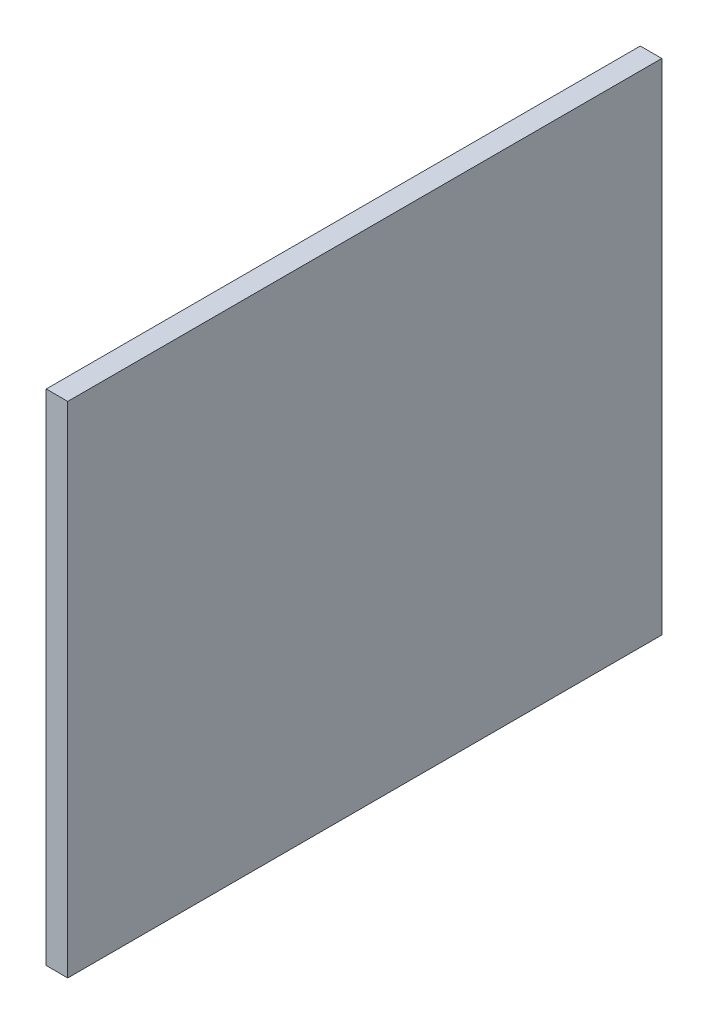
ISO-10303-21;
HEADER;
FILE_DESCRIPTION(('STEP AP214'),'2;1');
FILE_NAME('part.step','',(''),(''),'','','');
FILE_SCHEMA(('AUTOMOTIVE_DESIGN { 1 0 10303 214 1 1 1 1 }'));
ENDSEC;
DATA;
#1=APPLICATION_CONTEXT('core data for automotive mechanical design processes');
#2=APPLICATION_PROTOCOL_DEFINITION('international standard','automotive_design',2000,#1);
#3=PRODUCT_CONTEXT('',#1,'mechanical');
#4=PRODUCT('Part','Part','',(#3));
#5=PRODUCT_RELATED_PRODUCT_CATEGORY('part','',(#4));
#6=PRODUCT_DEFINITION_FORMATION('','',#4);
#7=PRODUCT_DEFINITION_CONTEXT('part definition',#1,'design');
#8=PRODUCT_DEFINITION('design','',#6,#7);
#9=PRODUCT_DEFINITION_SHAPE('','',#8);
#10=(LENGTH_UNIT() NAMED_UNIT(*) SI_UNIT(.MILLI.,.METRE.));
#11=(NAMED_UNIT(*) PLANE_ANGLE_UNIT() SI_UNIT($,.RADIAN.));
#12=(NAMED_UNIT(*) SI_UNIT($,.STERADIAN.) SOLID_ANGLE_UNIT());
#13=UNCERTAINTY_MEASURE_WITH_UNIT(LENGTH_MEASURE(1.E-05),#10,'distance_accuracy_value','');
#14=(GEOMETRIC_REPRESENTATION_CONTEXT(3) GLOBAL_UNCERTAINTY_ASSIGNED_CONTEXT((#13)) GLOBAL_UNIT_ASSIGNED_CONTEXT((#10,
#11,#12)) REPRESENTATION_CONTEXT('',''));
#15=CARTESIAN_POINT('',(0.,0.,0.));
#16=DIRECTION('',(0.,0.,1.));
#17=DIRECTION('',(1.,0.,0.));
#18=AXIS2_PLACEMENT_3D('',#15,#16,#17);
#19=CARTESIAN_POINT('',(0.5,-4.91094890510949,-6.43357664233577));
#20=DIRECTION('',(0.,0.,1.));
#21=DIRECTION('',(1.,0.,0.));
#22=AXIS2_PLACEMENT_3D('',#19,#20,#21);
#23=PLANE('',#22);
#24=DIRECTION('',(0.,1.,0.));
#25=VECTOR('',#24,1.);
#26=CARTESIAN_POINT('',(0.,-4.91094890510949,-6.43357664233577));
#27=LINE('',#26,#25);
#28=CARTESIAN_POINT('',(0.,-4.91094890510949,-6.43357664233577));
#29=VERTEX_POINT('',#28);
#30=CARTESIAN_POINT('',(0.,6.68905109489051,-6.43357664233577));
#31=VERTEX_POINT('',#30);
#32=EDGE_CURVE('E96',#29,#31,#27,.T.);
#33=ORIENTED_EDGE('',*,*,#32,.T.);
#34=DIRECTION('',(-1.,0.,0.));
#35=VECTOR('',#34,1.);
#36=CARTESIAN_POINT('',(0.5,6.68905109489051,-6.43357664233577));
#37=LINE('',#36,#35);
#38=CARTESIAN_POINT('',(0.5,6.68905109489051,-6.43357664233577));
#39=VERTEX_POINT('',#38);
#40=EDGE_CURVE('E11',#39,#31,#37,.T.);
#41=ORIENTED_EDGE('',*,*,#40,.F.);
#42=DIRECTION('',(0.,1.,0.));
#43=VECTOR('',#42,1.);
#44=CARTESIAN_POINT('',(0.5,-4.91094890510949,-6.43357664233577));
#45=LINE('',#44,#43);
#46=CARTESIAN_POINT('',(0.5,-4.91094890510949,-6.43357664233577));
#47=VERTEX_POINT('',#46);
#48=EDGE_CURVE('E84',#47,#39,#45,.T.);
#49=ORIENTED_EDGE('',*,*,#48,.F.);
#50=DIRECTION('',(-1.,0.,0.));
#51=VECTOR('',#50,1.);
#52=CARTESIAN_POINT('',(0.5,-4.91094890510949,-6.43357664233577));
#53=LINE('',#52,#51);
#54=EDGE_CURVE('E92',#47,#29,#53,.T.);
#55=ORIENTED_EDGE('',*,*,#54,.T.);
#56=EDGE_LOOP('',(#33,#41,#49,#55));
#57=FACE_BOUND('',#56,.T.);
#58=ADVANCED_FACE('F33',(#57),#23,.F.);
#59=CARTESIAN_POINT('',(0.5,6.68905109489051,-6.43357664233577));
#60=DIRECTION('',(0.,-1.,0.));
#61=DIRECTION('',(0.,0.,-1.));
#62=AXIS2_PLACEMENT_3D('',#59,#60,#61);
#63=PLANE('',#62);
#64=DIRECTION('',(0.,0.,1.));
#65=VECTOR('',#64,1.);
#66=CARTESIAN_POINT('',(0.,6.68905109489051,-6.43357664233577));
#67=LINE('',#66,#65);
#68=CARTESIAN_POINT('',(0.,6.68905109489051,7.36642335766423));
#69=VERTEX_POINT('',#68);
#70=EDGE_CURVE('E88',#31,#69,#67,.T.);
#71=ORIENTED_EDGE('',*,*,#70,.T.);
#72=DIRECTION('',(-1.,0.,0.));
#73=VECTOR('',#72,1.);
#74=CARTESIAN_POINT('',(0.5,6.68905109489051,7.36642335766423));
#75=LINE('',#74,#73);
#76=CARTESIAN_POINT('',(0.5,6.68905109489051,7.36642335766423));
#77=VERTEX_POINT('',#76);
#78=EDGE_CURVE('E41',#77,#69,#75,.T.);
#79=ORIENTED_EDGE('',*,*,#78,.F.);
#80=DIRECTION('',(0.,0.,1.));
#81=VECTOR('',#80,1.);
#82=CARTESIAN_POINT('',(0.5,6.68905109489051,-6.43357664233577));
#83=LINE('',#82,#81);
#84=EDGE_CURVE('E79',#39,#77,#83,.T.);
#85=ORIENTED_EDGE('',*,*,#84,.F.);
#86=ORIENTED_EDGE('',*,*,#40,.T.);
#87=EDGE_LOOP('',(#71,#79,#85,#86));
#88=FACE_BOUND('',#87,.T.);
#89=ADVANCED_FACE('F87',(#88),#63,.F.);
#90=CARTESIAN_POINT('',(0.5,-4.91094890510949,7.36642335766423));
#91=DIRECTION('',(0.,0.,-1.));
#92=DIRECTION('',(-1.,0.,0.));
#93=AXIS2_PLACEMENT_3D('',#90,#91,#92);
#94=PLANE('',#93);
#95=DIRECTION('',(0.,-1.,0.));
#96=VECTOR('',#95,1.);
#97=CARTESIAN_POINT('',(0.,-4.91094890510949,7.36642335766423));
#98=LINE('',#97,#96);
#99=CARTESIAN_POINT('',(0.,-4.91094890510949,7.36642335766423));
#100=VERTEX_POINT('',#99);
#101=EDGE_CURVE('E66',#69,#100,#98,.T.);
#102=ORIENTED_EDGE('',*,*,#101,.T.);
#103=DIRECTION('',(-1.,0.,0.));
#104=VECTOR('',#103,1.);
#105=CARTESIAN_POINT('',(0.5,-4.91094890510949,7.36642335766423));
#106=LINE('',#105,#104);
#107=CARTESIAN_POINT('',(0.5,-4.91094890510949,7.36642335766423));
#108=VERTEX_POINT('',#107);
#109=EDGE_CURVE('E89',#108,#100,#106,.T.);
#110=ORIENTED_EDGE('',*,*,#109,.F.);
#111=DIRECTION('',(0.,-1.,0.));
#112=VECTOR('',#111,1.);
#113=CARTESIAN_POINT('',(0.5,-4.91094890510949,7.36642335766423));
#114=LINE('',#113,#112);
#115=EDGE_CURVE('E82',#77,#108,#114,.T.);
#116=ORIENTED_EDGE('',*,*,#115,.F.);
#117=ORIENTED_EDGE('',*,*,#78,.T.);
#118=EDGE_LOOP('',(#102,#110,#116,#117));
#119=FACE_BOUND('',#118,.T.);
#120=ADVANCED_FACE('F90',(#119),#94,.F.);
#121=CARTESIAN_POINT('',(0.5,-4.91094890510949,-6.43357664233577));
#122=DIRECTION('',(0.,1.,0.));
#123=DIRECTION('',(0.,0.,1.));
#124=AXIS2_PLACEMENT_3D('',#121,#122,#123);
#125=PLANE('',#124);
#126=DIRECTION('',(0.,0.,-1.));
#127=VECTOR('',#126,1.);
#128=CARTESIAN_POINT('',(0.,-4.91094890510949,-6.43357664233577));
#129=LINE('',#128,#127);
#130=EDGE_CURVE('E72',#100,#29,#129,.T.);
#131=ORIENTED_EDGE('',*,*,#130,.T.);
#132=ORIENTED_EDGE('',*,*,#54,.F.);
#133=DIRECTION('',(0.,0.,-1.));
#134=VECTOR('',#133,1.);
#135=CARTESIAN_POINT('',(0.5,-4.91094890510949,-6.43357664233577));
#136=LINE('',#135,#134);
#137=EDGE_CURVE('E49',#108,#47,#136,.T.);
#138=ORIENTED_EDGE('',*,*,#137,.F.);
#139=ORIENTED_EDGE('',*,*,#109,.T.);
#140=EDGE_LOOP('',(#131,#132,#138,#139));
#141=FACE_BOUND('',#140,.T.);
#142=ADVANCED_FACE('F103',(#141),#125,.F.);
#143=CARTESIAN_POINT('',(0.5,0.,0.));
#144=DIRECTION('',(1.,0.,0.));
#145=DIRECTION('',(0.,0.,-1.));
#146=AXIS2_PLACEMENT_3D('',#143,#144,#145);
#147=PLANE('',#146);
#148=ORIENTED_EDGE('',*,*,#48,.T.);
#149=ORIENTED_EDGE('',*,*,#84,.T.);
#150=ORIENTED_EDGE('',*,*,#115,.T.);
#151=ORIENTED_EDGE('',*,*,#137,.T.);
#152=EDGE_LOOP('',(#148,#149,#150,#151));
#153=FACE_BOUND('',#152,.T.);
#154=ADVANCED_FACE('F80',(#153),#147,.T.);
#155=CARTESIAN_POINT('',(0.,0.,0.));
#156=DIRECTION('',(1.,0.,0.));
#157=DIRECTION('',(0.,0.,-1.));
#158=AXIS2_PLACEMENT_3D('',#155,#156,#157);
#159=PLANE('',#158);
#160=ORIENTED_EDGE('',*,*,#32,.F.);
#161=ORIENTED_EDGE('',*,*,#130,.F.);
#162=ORIENTED_EDGE('',*,*,#101,.F.);
#163=ORIENTED_EDGE('',*,*,#70,.F.);
#164=EDGE_LOOP('',(#160,#161,#162,#163));
#165=FACE_BOUND('',#164,.T.);
#166=ADVANCED_FACE('F106',(#165),#159,.F.);
#167=CLOSED_SHELL('',(#58,#89,#120,#142,#154,#166));
#168=MANIFOLD_SOLID_BREP('B2',#167);
#169=ADVANCED_BREP_SHAPE_REPRESENTATION('',(#18,#168),#14);
#170=SHAPE_DEFINITION_REPRESENTATION(#9,#169);
ENDSEC;
END-ISO-10303-21;
